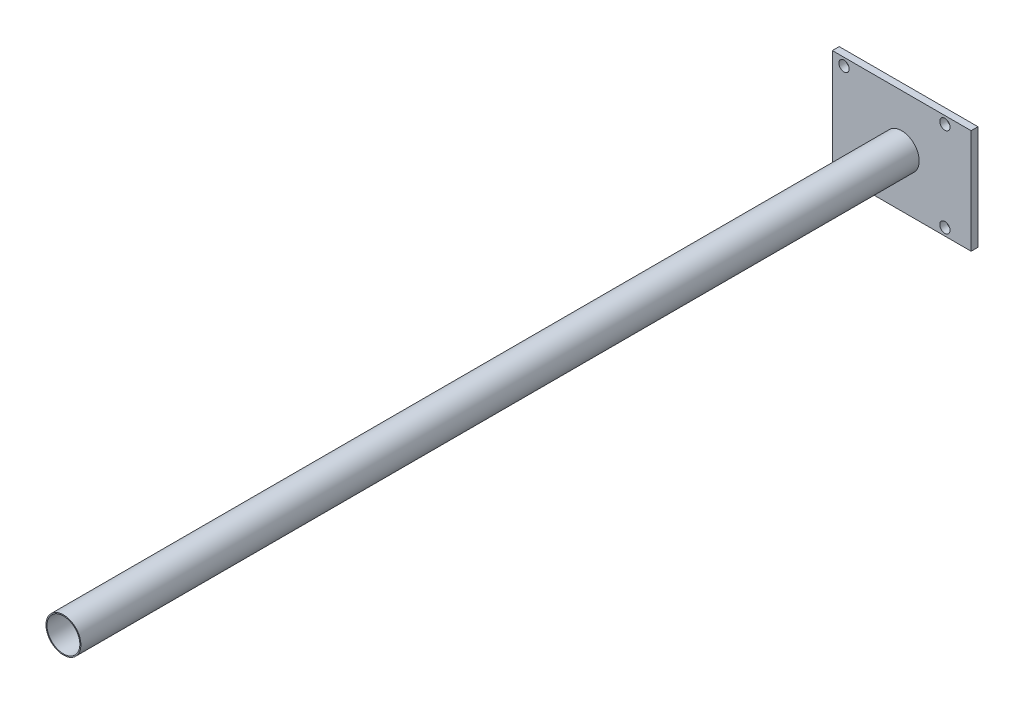
ISO-10303-21;
HEADER;
FILE_DESCRIPTION(('STEP AP214'),'2;1');
FILE_NAME('part.step','',(''),(''),'','','');
FILE_SCHEMA(('AUTOMOTIVE_DESIGN { 1 0 10303 214 1 1 1 1 }'));
ENDSEC;
DATA;
#1=APPLICATION_CONTEXT('core data for automotive mechanical design processes');
#2=APPLICATION_PROTOCOL_DEFINITION('international standard','automotive_design',2000,#1);
#3=PRODUCT_CONTEXT('',#1,'mechanical');
#4=PRODUCT('Part','Part','',(#3));
#5=PRODUCT_RELATED_PRODUCT_CATEGORY('part','',(#4));
#6=PRODUCT_DEFINITION_FORMATION('','',#4);
#7=PRODUCT_DEFINITION_CONTEXT('part definition',#1,'design');
#8=PRODUCT_DEFINITION('design','',#6,#7);
#9=PRODUCT_DEFINITION_SHAPE('','',#8);
#10=(LENGTH_UNIT() NAMED_UNIT(*) SI_UNIT(.MILLI.,.METRE.));
#11=(NAMED_UNIT(*) PLANE_ANGLE_UNIT() SI_UNIT($,.RADIAN.));
#12=(NAMED_UNIT(*) SI_UNIT($,.STERADIAN.) SOLID_ANGLE_UNIT());
#13=UNCERTAINTY_MEASURE_WITH_UNIT(LENGTH_MEASURE(1.E-05),#10,'distance_accuracy_value','');
#14=(GEOMETRIC_REPRESENTATION_CONTEXT(3) GLOBAL_UNCERTAINTY_ASSIGNED_CONTEXT((#13)) GLOBAL_UNIT_ASSIGNED_CONTEXT((#10,
#11,#12)) REPRESENTATION_CONTEXT('',''));
#15=CARTESIAN_POINT('',(0.,0.,0.));
#16=DIRECTION('',(0.,0.,1.));
#17=DIRECTION('',(1.,0.,0.));
#18=AXIS2_PLACEMENT_3D('',#15,#16,#17);
#19=CARTESIAN_POINT('',(0.,0.,10.));
#20=DIRECTION('',(0.,0.,1.));
#21=DIRECTION('',(1.,0.,0.));
#22=AXIS2_PLACEMENT_3D('',#19,#20,#21);
#23=PLANE('',#22);
#24=CARTESIAN_POINT('',(-101.,76.,10.));
#25=DIRECTION('',(0.,0.,1.));
#26=DIRECTION('',(1.,0.,0.));
#27=AXIS2_PLACEMENT_3D('',#24,#25,#26);
#28=CIRCLE('',#27,25.4);
#29=CARTESIAN_POINT('',(-75.6,76.,10.));
#30=VERTEX_POINT('',#29);
#31=EDGE_CURVE('E137',#30,#30,#28,.T.);
#32=ORIENTED_EDGE('',*,*,#31,.F.);
#33=EDGE_LOOP('',(#32));
#34=FACE_BOUND('',#33,.T.);
#35=CARTESIAN_POINT('',(-38.1778705125487,141.,10.));
#36=DIRECTION('',(0.,0.,1.));
#37=DIRECTION('',(1.,0.,0.));
#38=AXIS2_PLACEMENT_3D('',#35,#36,#37);
#39=CIRCLE('',#38,7.5);
#40=CARTESIAN_POINT('',(-30.6778705125487,141.,10.));
#41=VERTEX_POINT('',#40);
#42=EDGE_CURVE('E141',#41,#41,#39,.T.);
#43=ORIENTED_EDGE('',*,*,#42,.F.);
#44=EDGE_LOOP('',(#43));
#45=FACE_BOUND('',#44,.T.);
#46=CARTESIAN_POINT('',(-185.,141.,10.));
#47=DIRECTION('',(0.,0.,1.));
#48=DIRECTION('',(1.,0.,0.));
#49=AXIS2_PLACEMENT_3D('',#46,#47,#48);
#50=CIRCLE('',#49,7.50000000000001);
#51=CARTESIAN_POINT('',(-177.5,141.,10.));
#52=VERTEX_POINT('',#51);
#53=EDGE_CURVE('E103',#52,#52,#50,.T.);
#54=ORIENTED_EDGE('',*,*,#53,.F.);
#55=EDGE_LOOP('',(#54));
#56=FACE_BOUND('',#55,.T.);
#57=DIRECTION('',(0.,1.,0.));
#58=VECTOR('',#57,1.);
#59=CARTESIAN_POINT('',(0.,0.,10.));
#60=LINE('',#59,#58);
#61=CARTESIAN_POINT('',(0.,0.,10.));
#62=VERTEX_POINT('',#61);
#63=CARTESIAN_POINT('',(0.,152.,10.));
#64=VERTEX_POINT('',#63);
#65=EDGE_CURVE('E86',#62,#64,#60,.T.);
#66=ORIENTED_EDGE('',*,*,#65,.T.);
#67=DIRECTION('',(-1.,0.,0.));
#68=VECTOR('',#67,1.);
#69=CARTESIAN_POINT('',(0.,152.,10.));
#70=LINE('',#69,#68);
#71=CARTESIAN_POINT('',(-202.,152.,10.));
#72=VERTEX_POINT('',#71);
#73=EDGE_CURVE('E81',#64,#72,#70,.T.);
#74=ORIENTED_EDGE('',*,*,#73,.T.);
#75=DIRECTION('',(0.,-1.,0.));
#76=VECTOR('',#75,1.);
#77=CARTESIAN_POINT('',(-202.,0.,10.));
#78=LINE('',#77,#76);
#79=CARTESIAN_POINT('',(-202.,0.,10.));
#80=VERTEX_POINT('',#79);
#81=EDGE_CURVE('E84',#72,#80,#78,.T.);
#82=ORIENTED_EDGE('',*,*,#81,.T.);
#83=DIRECTION('',(1.,0.,0.));
#84=VECTOR('',#83,1.);
#85=CARTESIAN_POINT('',(0.,0.,10.));
#86=LINE('',#85,#84);
#87=EDGE_CURVE('E50',#80,#62,#86,.T.);
#88=ORIENTED_EDGE('',*,*,#87,.T.);
#89=EDGE_LOOP('',(#66,#74,#82,#88));
#90=FACE_BOUND('',#89,.T.);
#91=CARTESIAN_POINT('',(-185.,11.,10.));
#92=DIRECTION('',(0.,0.,1.));
#93=DIRECTION('',(1.,0.,0.));
#94=AXIS2_PLACEMENT_3D('',#91,#92,#93);
#95=CIRCLE('',#94,7.50000000000001);
#96=CARTESIAN_POINT('',(-177.5,11.,10.));
#97=VERTEX_POINT('',#96);
#98=EDGE_CURVE('E145',#97,#97,#95,.T.);
#99=ORIENTED_EDGE('',*,*,#98,.F.);
#100=EDGE_LOOP('',(#99));
#101=FACE_BOUND('',#100,.T.);
#102=CARTESIAN_POINT('',(-38.1778705125487,11.,10.));
#103=DIRECTION('',(0.,0.,1.));
#104=DIRECTION('',(1.,0.,0.));
#105=AXIS2_PLACEMENT_3D('',#102,#103,#104);
#106=CIRCLE('',#105,7.5);
#107=CARTESIAN_POINT('',(-30.6778705125487,11.,10.));
#108=VERTEX_POINT('',#107);
#109=EDGE_CURVE('E131',#108,#108,#106,.T.);
#110=ORIENTED_EDGE('',*,*,#109,.F.);
#111=EDGE_LOOP('',(#110));
#112=FACE_BOUND('',#111,.T.);
#113=ADVANCED_FACE('F33',(#34,#45,#56,#90,#101,#112),#23,.T.);
#114=CARTESIAN_POINT('',(0.,0.,0.));
#115=DIRECTION('',(0.,0.,1.));
#116=DIRECTION('',(1.,0.,0.));
#117=AXIS2_PLACEMENT_3D('',#114,#115,#116);
#118=PLANE('',#117);
#119=DIRECTION('',(0.,1.,0.));
#120=VECTOR('',#119,1.);
#121=CARTESIAN_POINT('',(0.,0.,0.));
#122=LINE('',#121,#120);
#123=CARTESIAN_POINT('',(0.,0.,0.));
#124=VERTEX_POINT('',#123);
#125=CARTESIAN_POINT('',(0.,152.,0.));
#126=VERTEX_POINT('',#125);
#127=EDGE_CURVE('E100',#124,#126,#122,.T.);
#128=ORIENTED_EDGE('',*,*,#127,.F.);
#129=DIRECTION('',(1.,0.,0.));
#130=VECTOR('',#129,1.);
#131=CARTESIAN_POINT('',(0.,0.,0.));
#132=LINE('',#131,#130);
#133=CARTESIAN_POINT('',(-202.,0.,0.));
#134=VERTEX_POINT('',#133);
#135=EDGE_CURVE('E73',#134,#124,#132,.T.);
#136=ORIENTED_EDGE('',*,*,#135,.F.);
#137=DIRECTION('',(0.,-1.,0.));
#138=VECTOR('',#137,1.);
#139=CARTESIAN_POINT('',(-202.,0.,0.));
#140=LINE('',#139,#138);
#141=CARTESIAN_POINT('',(-202.,152.,0.));
#142=VERTEX_POINT('',#141);
#143=EDGE_CURVE('E67',#142,#134,#140,.T.);
#144=ORIENTED_EDGE('',*,*,#143,.F.);
#145=DIRECTION('',(-1.,0.,0.));
#146=VECTOR('',#145,1.);
#147=CARTESIAN_POINT('',(0.,152.,0.));
#148=LINE('',#147,#146);
#149=EDGE_CURVE('E91',#126,#142,#148,.T.);
#150=ORIENTED_EDGE('',*,*,#149,.F.);
#151=EDGE_LOOP('',(#128,#136,#144,#150));
#152=FACE_BOUND('',#151,.T.);
#153=CARTESIAN_POINT('',(-185.,141.,0.));
#154=DIRECTION('',(0.,0.,1.));
#155=DIRECTION('',(1.,0.,0.));
#156=AXIS2_PLACEMENT_3D('',#153,#154,#155);
#157=CIRCLE('',#156,7.50000000000001);
#158=CARTESIAN_POINT('',(-177.5,141.,0.));
#159=VERTEX_POINT('',#158);
#160=EDGE_CURVE('E118',#159,#159,#157,.T.);
#161=ORIENTED_EDGE('',*,*,#160,.T.);
#162=EDGE_LOOP('',(#161));
#163=FACE_BOUND('',#162,.T.);
#164=CARTESIAN_POINT('',(-185.,11.,0.));
#165=DIRECTION('',(0.,0.,1.));
#166=DIRECTION('',(1.,0.,0.));
#167=AXIS2_PLACEMENT_3D('',#164,#165,#166);
#168=CIRCLE('',#167,7.50000000000001);
#169=CARTESIAN_POINT('',(-177.5,11.,0.));
#170=VERTEX_POINT('',#169);
#171=EDGE_CURVE('E122',#170,#170,#168,.T.);
#172=ORIENTED_EDGE('',*,*,#171,.T.);
#173=EDGE_LOOP('',(#172));
#174=FACE_BOUND('',#173,.T.);
#175=CARTESIAN_POINT('',(-38.1778705125487,141.,0.));
#176=DIRECTION('',(0.,0.,1.));
#177=DIRECTION('',(1.,0.,0.));
#178=AXIS2_PLACEMENT_3D('',#175,#176,#177);
#179=CIRCLE('',#178,7.5);
#180=CARTESIAN_POINT('',(-30.6778705125487,141.,0.));
#181=VERTEX_POINT('',#180);
#182=EDGE_CURVE('E126',#181,#181,#179,.T.);
#183=ORIENTED_EDGE('',*,*,#182,.T.);
#184=EDGE_LOOP('',(#183));
#185=FACE_BOUND('',#184,.T.);
#186=CARTESIAN_POINT('',(-38.1778705125487,11.,0.));
#187=DIRECTION('',(0.,0.,1.));
#188=DIRECTION('',(1.,0.,0.));
#189=AXIS2_PLACEMENT_3D('',#186,#187,#188);
#190=CIRCLE('',#189,7.5);
#191=CARTESIAN_POINT('',(-30.6778705125487,11.,0.));
#192=VERTEX_POINT('',#191);
#193=EDGE_CURVE('E129',#192,#192,#190,.T.);
#194=ORIENTED_EDGE('',*,*,#193,.T.);
#195=EDGE_LOOP('',(#194));
#196=FACE_BOUND('',#195,.T.);
#197=ADVANCED_FACE('F111',(#152,#163,#174,#185,#196),#118,.F.);
#198=CARTESIAN_POINT('',(0.,0.,10.));
#199=DIRECTION('',(-1.,0.,0.));
#200=DIRECTION('',(0.,0.,1.));
#201=AXIS2_PLACEMENT_3D('',#198,#199,#200);
#202=PLANE('',#201);
#203=ORIENTED_EDGE('',*,*,#127,.T.);
#204=DIRECTION('',(0.,0.,-1.));
#205=VECTOR('',#204,1.);
#206=CARTESIAN_POINT('',(0.,152.,10.));
#207=LINE('',#206,#205);
#208=EDGE_CURVE('E42',#64,#126,#207,.T.);
#209=ORIENTED_EDGE('',*,*,#208,.F.);
#210=ORIENTED_EDGE('',*,*,#65,.F.);
#211=DIRECTION('',(0.,0.,-1.));
#212=VECTOR('',#211,1.);
#213=CARTESIAN_POINT('',(0.,0.,10.));
#214=LINE('',#213,#212);
#215=EDGE_CURVE('E96',#62,#124,#214,.T.);
#216=ORIENTED_EDGE('',*,*,#215,.T.);
#217=EDGE_LOOP('',(#203,#209,#210,#216));
#218=FACE_BOUND('',#217,.T.);
#219=ADVANCED_FACE('F35',(#218),#202,.F.);
#220=CARTESIAN_POINT('',(0.,152.,10.));
#221=DIRECTION('',(0.,-1.,0.));
#222=DIRECTION('',(1.,0.,0.));
#223=AXIS2_PLACEMENT_3D('',#220,#221,#222);
#224=PLANE('',#223);
#225=ORIENTED_EDGE('',*,*,#149,.T.);
#226=DIRECTION('',(0.,0.,-1.));
#227=VECTOR('',#226,1.);
#228=CARTESIAN_POINT('',(-202.,152.,10.));
#229=LINE('',#228,#227);
#230=EDGE_CURVE('E89',#72,#142,#229,.T.);
#231=ORIENTED_EDGE('',*,*,#230,.F.);
#232=ORIENTED_EDGE('',*,*,#73,.F.);
#233=ORIENTED_EDGE('',*,*,#208,.T.);
#234=EDGE_LOOP('',(#225,#231,#232,#233));
#235=FACE_BOUND('',#234,.T.);
#236=ADVANCED_FACE('F90',(#235),#224,.F.);
#237=CARTESIAN_POINT('',(-202.,0.,10.));
#238=DIRECTION('',(1.,0.,0.));
#239=DIRECTION('',(0.,0.,-1.));
#240=AXIS2_PLACEMENT_3D('',#237,#238,#239);
#241=PLANE('',#240);
#242=ORIENTED_EDGE('',*,*,#143,.T.);
#243=DIRECTION('',(0.,0.,-1.));
#244=VECTOR('',#243,1.);
#245=CARTESIAN_POINT('',(-202.,0.,10.));
#246=LINE('',#245,#244);
#247=EDGE_CURVE('E92',#80,#134,#246,.T.);
#248=ORIENTED_EDGE('',*,*,#247,.F.);
#249=ORIENTED_EDGE('',*,*,#81,.F.);
#250=ORIENTED_EDGE('',*,*,#230,.T.);
#251=EDGE_LOOP('',(#242,#248,#249,#250));
#252=FACE_BOUND('',#251,.T.);
#253=ADVANCED_FACE('F94',(#252),#241,.F.);
#254=CARTESIAN_POINT('',(0.,0.,10.));
#255=DIRECTION('',(0.,1.,0.));
#256=DIRECTION('',(0.,0.,1.));
#257=AXIS2_PLACEMENT_3D('',#254,#255,#256);
#258=PLANE('',#257);
#259=ORIENTED_EDGE('',*,*,#135,.T.);
#260=ORIENTED_EDGE('',*,*,#215,.F.);
#261=ORIENTED_EDGE('',*,*,#87,.F.);
#262=ORIENTED_EDGE('',*,*,#247,.T.);
#263=EDGE_LOOP('',(#259,#260,#261,#262));
#264=FACE_BOUND('',#263,.T.);
#265=ADVANCED_FACE('F199',(#264),#258,.F.);
#266=CARTESIAN_POINT('',(-185.,141.,10.));
#267=DIRECTION('',(0.,0.,-1.));
#268=DIRECTION('',(-1.,0.,0.));
#269=AXIS2_PLACEMENT_3D('',#266,#267,#268);
#270=CYLINDRICAL_SURFACE('',#269,7.50000000000001);
#271=ORIENTED_EDGE('',*,*,#53,.T.);
#272=EDGE_LOOP('',(#271));
#273=FACE_BOUND('',#272,.T.);
#274=ORIENTED_EDGE('',*,*,#160,.F.);
#275=EDGE_LOOP('',(#274));
#276=FACE_BOUND('',#275,.T.);
#277=ADVANCED_FACE('F153',(#273,#276),#270,.F.);
#278=CARTESIAN_POINT('',(-185.,11.,10.));
#279=DIRECTION('',(0.,0.,-1.));
#280=DIRECTION('',(-1.,0.,0.));
#281=AXIS2_PLACEMENT_3D('',#278,#279,#280);
#282=CYLINDRICAL_SURFACE('',#281,7.50000000000001);
#283=ORIENTED_EDGE('',*,*,#98,.T.);
#284=EDGE_LOOP('',(#283));
#285=FACE_BOUND('',#284,.T.);
#286=ORIENTED_EDGE('',*,*,#171,.F.);
#287=EDGE_LOOP('',(#286));
#288=FACE_BOUND('',#287,.T.);
#289=ADVANCED_FACE('F194',(#285,#288),#282,.F.);
#290=CARTESIAN_POINT('',(-38.1778705125487,141.,10.));
#291=DIRECTION('',(0.,0.,-1.));
#292=DIRECTION('',(-1.,0.,0.));
#293=AXIS2_PLACEMENT_3D('',#290,#291,#292);
#294=CYLINDRICAL_SURFACE('',#293,7.5);
#295=ORIENTED_EDGE('',*,*,#42,.T.);
#296=EDGE_LOOP('',(#295));
#297=FACE_BOUND('',#296,.T.);
#298=ORIENTED_EDGE('',*,*,#182,.F.);
#299=EDGE_LOOP('',(#298));
#300=FACE_BOUND('',#299,.T.);
#301=ADVANCED_FACE('F190',(#297,#300),#294,.F.);
#302=CARTESIAN_POINT('',(-38.1778705125487,11.,10.));
#303=DIRECTION('',(0.,0.,-1.));
#304=DIRECTION('',(-1.,0.,0.));
#305=AXIS2_PLACEMENT_3D('',#302,#303,#304);
#306=CYLINDRICAL_SURFACE('',#305,7.5);
#307=ORIENTED_EDGE('',*,*,#109,.T.);
#308=EDGE_LOOP('',(#307));
#309=FACE_BOUND('',#308,.T.);
#310=ORIENTED_EDGE('',*,*,#193,.F.);
#311=EDGE_LOOP('',(#310));
#312=FACE_BOUND('',#311,.T.);
#313=ADVANCED_FACE('F185',(#309,#312),#306,.F.);
#314=CARTESIAN_POINT('',(-101.,76.,1230.));
#315=DIRECTION('',(0.,0.,1.));
#316=DIRECTION('',(1.,0.,0.));
#317=AXIS2_PLACEMENT_3D('',#314,#315,#316);
#318=PLANE('',#317);
#319=CARTESIAN_POINT('',(-101.,76.,1230.));
#320=DIRECTION('',(0.,0.,1.));
#321=DIRECTION('',(1.,0.,0.));
#322=AXIS2_PLACEMENT_3D('',#319,#320,#321);
#323=CIRCLE('',#322,25.4);
#324=CARTESIAN_POINT('',(-75.6,76.,1230.));
#325=VERTEX_POINT('',#324);
#326=EDGE_CURVE('E132',#325,#325,#323,.T.);
#327=ORIENTED_EDGE('',*,*,#326,.T.);
#328=EDGE_LOOP('',(#327));
#329=FACE_BOUND('',#328,.T.);
#330=CARTESIAN_POINT('',(-101.,76.,1230.));
#331=DIRECTION('',(0.,0.,1.));
#332=DIRECTION('',(1.,0.,0.));
#333=AXIS2_PLACEMENT_3D('',#330,#331,#332);
#334=CIRCLE('',#333,23.9);
#335=CARTESIAN_POINT('',(-77.1,76.,1230.));
#336=VERTEX_POINT('',#335);
#337=EDGE_CURVE('E293',#336,#336,#334,.T.);
#338=ORIENTED_EDGE('',*,*,#337,.F.);
#339=EDGE_LOOP('',(#338));
#340=FACE_BOUND('',#339,.T.);
#341=ADVANCED_FACE('F179',(#329,#340),#318,.T.);
#342=CARTESIAN_POINT('',(-101.,76.,1230.));
#343=DIRECTION('',(0.,0.,-1.));
#344=DIRECTION('',(-1.,0.,0.));
#345=AXIS2_PLACEMENT_3D('',#342,#343,#344);
#346=CYLINDRICAL_SURFACE('',#345,25.4);
#347=ORIENTED_EDGE('',*,*,#326,.F.);
#348=EDGE_LOOP('',(#347));
#349=FACE_BOUND('',#348,.T.);
#350=ORIENTED_EDGE('',*,*,#31,.T.);
#351=EDGE_LOOP('',(#350));
#352=FACE_BOUND('',#351,.T.);
#353=ADVANCED_FACE('F171',(#349,#352),#346,.T.);
#354=CARTESIAN_POINT('',(-101.,76.,1230.));
#355=DIRECTION('',(0.,0.,-1.));
#356=DIRECTION('',(-1.,0.,0.));
#357=AXIS2_PLACEMENT_3D('',#354,#355,#356);
#358=CYLINDRICAL_SURFACE('',#357,23.9);
#359=ORIENTED_EDGE('',*,*,#337,.T.);
#360=EDGE_LOOP('',(#359));
#361=FACE_BOUND('',#360,.T.);
#362=CARTESIAN_POINT('',(-101.,76.,10.));
#363=DIRECTION('',(0.,0.,1.));
#364=DIRECTION('',(1.,0.,0.));
#365=AXIS2_PLACEMENT_3D('',#362,#363,#364);
#366=CIRCLE('',#365,23.9);
#367=CARTESIAN_POINT('',(-77.1,76.,10.));
#368=VERTEX_POINT('',#367);
#369=EDGE_CURVE('E11',#368,#368,#366,.F.);
#370=ORIENTED_EDGE('',*,*,#369,.T.);
#371=EDGE_LOOP('',(#370));
#372=FACE_BOUND('',#371,.T.);
#373=ADVANCED_FACE('F166',(#361,#372),#358,.F.);
#374=ORIENTED_EDGE('',*,*,#369,.F.);
#375=EDGE_LOOP('',(#374));
#376=FACE_BOUND('',#375,.T.);
#377=ADVANCED_FACE('F159',(#376),#23,.T.);
#378=CLOSED_SHELL('',(#113,#197,#219,#236,#253,#265,#277,#289,#301,#313,#341,#353,#373,#377));
#379=MANIFOLD_SOLID_BREP('B2',#378);
#380=ADVANCED_BREP_SHAPE_REPRESENTATION('',(#18,#379),#14);
#381=SHAPE_DEFINITION_REPRESENTATION(#9,#380);
ENDSEC;
END-ISO-10303-21;
